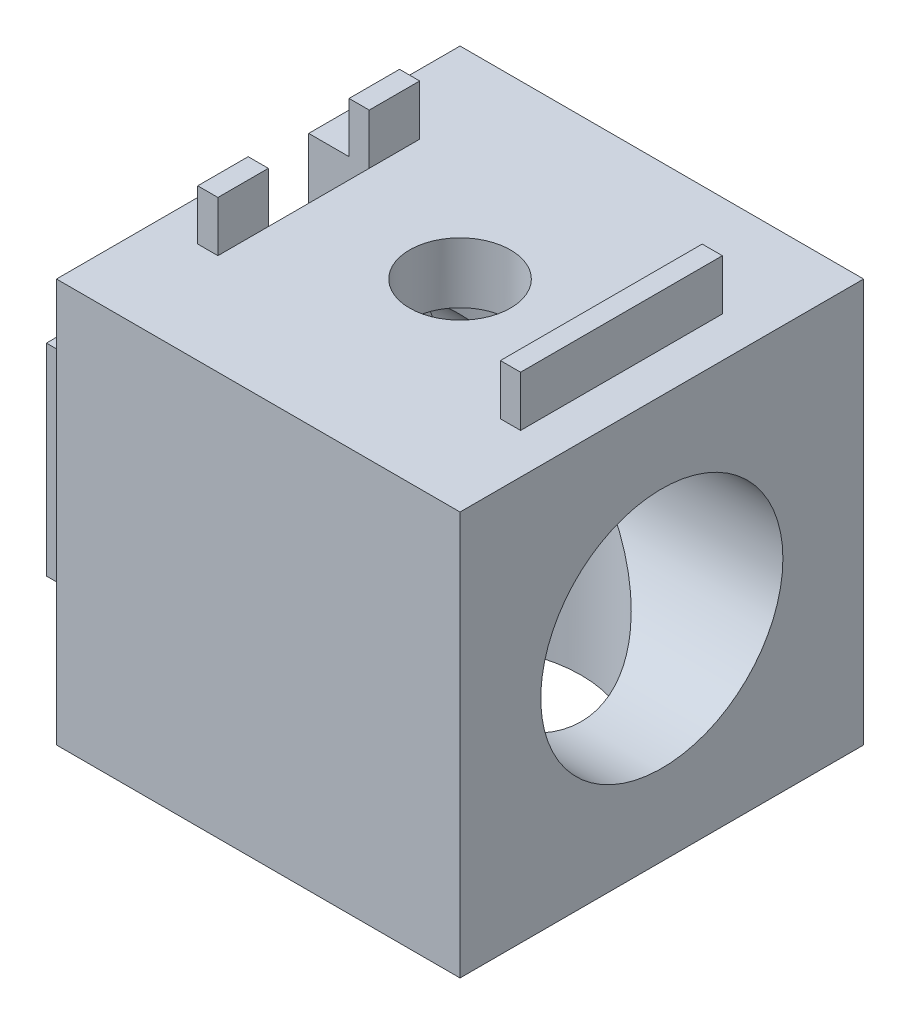
ISO-10303-21;
HEADER;
FILE_DESCRIPTION(('STEP AP214'),'2;1');
FILE_NAME('part.step','',(''),(''),'','','');
FILE_SCHEMA(('AUTOMOTIVE_DESIGN { 1 0 10303 214 1 1 1 1 }'));
ENDSEC;
DATA;
#1=APPLICATION_CONTEXT('core data for automotive mechanical design processes');
#2=APPLICATION_PROTOCOL_DEFINITION('international standard','automotive_design',2000,#1);
#3=PRODUCT_CONTEXT('',#1,'mechanical');
#4=PRODUCT('Part','Part','',(#3));
#5=PRODUCT_RELATED_PRODUCT_CATEGORY('part','',(#4));
#6=PRODUCT_DEFINITION_FORMATION('','',#4);
#7=PRODUCT_DEFINITION_CONTEXT('part definition',#1,'design');
#8=PRODUCT_DEFINITION('design','',#6,#7);
#9=PRODUCT_DEFINITION_SHAPE('','',#8);
#10=(LENGTH_UNIT() NAMED_UNIT(*) SI_UNIT(.MILLI.,.METRE.));
#11=(NAMED_UNIT(*) PLANE_ANGLE_UNIT() SI_UNIT($,.RADIAN.));
#12=(NAMED_UNIT(*) SI_UNIT($,.STERADIAN.) SOLID_ANGLE_UNIT());
#13=UNCERTAINTY_MEASURE_WITH_UNIT(LENGTH_MEASURE(1.E-05),#10,'distance_accuracy_value','');
#14=(GEOMETRIC_REPRESENTATION_CONTEXT(3) GLOBAL_UNCERTAINTY_ASSIGNED_CONTEXT((#13)) GLOBAL_UNIT_ASSIGNED_CONTEXT((#10,
#11,#12)) REPRESENTATION_CONTEXT('',''));
#15=CARTESIAN_POINT('',(0.,0.,0.));
#16=DIRECTION('',(0.,0.,1.));
#17=DIRECTION('',(1.,0.,0.));
#18=AXIS2_PLACEMENT_3D('',#15,#16,#17);
#19=CARTESIAN_POINT('',(10.,0.,-10.));
#20=DIRECTION('',(0.,1.,0.));
#21=DIRECTION('',(0.,0.,1.));
#22=AXIS2_PLACEMENT_3D('',#19,#20,#21);
#23=CYLINDRICAL_SURFACE('',#22,2.5);
#24=CARTESIAN_POINT('',(10.,20.,-10.));
#25=DIRECTION('',(0.,1.,0.));
#26=DIRECTION('',(0.,0.,1.));
#27=AXIS2_PLACEMENT_3D('',#24,#25,#26);
#28=CIRCLE('',#27,2.5);
#29=CARTESIAN_POINT('',(10.,20.,-7.5));
#30=VERTEX_POINT('',#29);
#31=EDGE_CURVE('E481',#30,#30,#28,.T.);
#32=ORIENTED_EDGE('',*,*,#31,.T.);
#33=EDGE_LOOP('',(#32));
#34=FACE_BOUND('',#33,.T.);
#35=CARTESIAN_POINT('',(10.,17.,-10.));
#36=DIRECTION('',(0.,-1.,0.));
#37=DIRECTION('',(0.,0.,-1.));
#38=AXIS2_PLACEMENT_3D('',#35,#36,#37);
#39=CIRCLE('',#38,2.5);
#40=CARTESIAN_POINT('',(10.,17.,-12.5));
#41=VERTEX_POINT('',#40);
#42=EDGE_CURVE('E37',#41,#41,#39,.F.);
#43=ORIENTED_EDGE('',*,*,#42,.F.);
#44=EDGE_LOOP('',(#43));
#45=FACE_BOUND('',#44,.T.);
#46=ADVANCED_FACE('F33',(#34,#45),#23,.F.);
#47=CARTESIAN_POINT('',(3.,10.,-10.));
#48=DIRECTION('',(1.,0.,0.));
#49=DIRECTION('',(0.,0.,-1.));
#50=AXIS2_PLACEMENT_3D('',#47,#48,#49);
#51=CYLINDRICAL_SURFACE('',#50,6.);
#52=CARTESIAN_POINT('',(20.,10.,-10.));
#53=DIRECTION('',(1.,0.,0.));
#54=DIRECTION('',(0.,0.,-1.));
#55=AXIS2_PLACEMENT_3D('',#52,#53,#54);
#56=CIRCLE('',#55,6.);
#57=CARTESIAN_POINT('',(20.,10.,-16.));
#58=VERTEX_POINT('',#57);
#59=EDGE_CURVE('E802',#58,#58,#56,.T.);
#60=ORIENTED_EDGE('',*,*,#59,.T.);
#61=EDGE_LOOP('',(#60));
#62=FACE_BOUND('',#61,.T.);
#63=CARTESIAN_POINT('',(10.,10.,-10.));
#64=DIRECTION('',(0.707106781186547,0.707106781186547,0.));
#65=DIRECTION('',(0.707106781186547,-0.707106781186547,0.));
#66=AXIS2_PLACEMENT_3D('',#63,#64,#65);
#67=ELLIPSE('',#66,8.48528137423857,6.);
#68=CARTESIAN_POINT('',(10.,10.,-16.));
#69=VERTEX_POINT('',#68);
#70=CARTESIAN_POINT('',(10.,10.,-4.));
#71=VERTEX_POINT('',#70);
#72=EDGE_CURVE('E47',#69,#71,#67,.F.);
#73=ORIENTED_EDGE('',*,*,#72,.T.);
#74=CARTESIAN_POINT('',(10.,10.,-10.));
#75=DIRECTION('',(0.707106781186547,-0.707106781186547,0.));
#76=DIRECTION('',(0.707106781186547,0.707106781186547,0.));
#77=AXIS2_PLACEMENT_3D('',#74,#75,#76);
#78=ELLIPSE('',#77,8.48528137423857,6.);
#79=EDGE_CURVE('E11',#71,#69,#78,.F.);
#80=ORIENTED_EDGE('',*,*,#79,.T.);
#81=EDGE_LOOP('',(#73,#80));
#82=FACE_BOUND('',#81,.T.);
#83=ADVANCED_FACE('F240',(#62,#82),#51,.F.);
#84=CARTESIAN_POINT('',(3.,20.,-7.5));
#85=DIRECTION('',(1.,0.,0.));
#86=DIRECTION('',(0.,0.,-1.));
#87=AXIS2_PLACEMENT_3D('',#84,#85,#86);
#88=PLANE('',#87);
#89=DIRECTION('',(0.,-1.,0.));
#90=VECTOR('',#89,1.);
#91=CARTESIAN_POINT('',(3.,20.,-12.5));
#92=LINE('',#91,#90);
#93=CARTESIAN_POINT('',(3.,20.,-12.5));
#94=VERTEX_POINT('',#93);
#95=CARTESIAN_POINT('',(3.,15.4543560573179,-12.5));
#96=VERTEX_POINT('',#95);
#97=EDGE_CURVE('E297',#94,#96,#92,.T.);
#98=ORIENTED_EDGE('',*,*,#97,.T.);
#99=CARTESIAN_POINT('',(3.,10.,-10.));
#100=DIRECTION('',(1.,0.,0.));
#101=DIRECTION('',(0.,0.,-1.));
#102=AXIS2_PLACEMENT_3D('',#99,#100,#101);
#103=CIRCLE('',#102,6.);
#104=CARTESIAN_POINT('',(3.,15.4543560573179,-7.5));
#105=VERTEX_POINT('',#104);
#106=EDGE_CURVE('E363',#96,#105,#103,.T.);
#107=ORIENTED_EDGE('',*,*,#106,.T.);
#108=DIRECTION('',(0.,-1.,0.));
#109=VECTOR('',#108,1.);
#110=CARTESIAN_POINT('',(3.,20.,-7.5));
#111=LINE('',#110,#109);
#112=CARTESIAN_POINT('',(3.,20.,-7.5));
#113=VERTEX_POINT('',#112);
#114=EDGE_CURVE('E292',#113,#105,#111,.T.);
#115=ORIENTED_EDGE('',*,*,#114,.F.);
#116=DIRECTION('',(0.,0.,1.));
#117=VECTOR('',#116,1.);
#118=CARTESIAN_POINT('',(3.,20.,-7.5));
#119=LINE('',#118,#117);
#120=EDGE_CURVE('E263',#94,#113,#119,.T.);
#121=ORIENTED_EDGE('',*,*,#120,.F.);
#122=EDGE_LOOP('',(#98,#107,#115,#121));
#123=FACE_BOUND('',#122,.T.);
#124=ADVANCED_FACE('F361',(#123),#88,.F.);
#125=CARTESIAN_POINT('',(0.,20.,-12.5));
#126=DIRECTION('',(1.,0.,0.));
#127=DIRECTION('',(0.,0.,-1.));
#128=AXIS2_PLACEMENT_3D('',#125,#126,#127);
#129=PLANE('',#128);
#130=DIRECTION('',(0.,0.,1.));
#131=VECTOR('',#130,1.);
#132=CARTESIAN_POINT('',(0.,0.,-12.5));
#133=LINE('',#132,#131);
#134=CARTESIAN_POINT('',(0.,0.,-20.));
#135=VERTEX_POINT('',#134);
#136=CARTESIAN_POINT('',(0.,0.,-12.5));
#137=VERTEX_POINT('',#136);
#138=EDGE_CURVE('E278',#135,#137,#133,.T.);
#139=ORIENTED_EDGE('',*,*,#138,.T.);
#140=DIRECTION('',(0.,-1.,0.));
#141=VECTOR('',#140,1.);
#142=CARTESIAN_POINT('',(0.,20.,-12.5));
#143=LINE('',#142,#141);
#144=CARTESIAN_POINT('',(0.,20.,-12.5));
#145=VERTEX_POINT('',#144);
#146=EDGE_CURVE('E300',#145,#137,#143,.T.);
#147=ORIENTED_EDGE('',*,*,#146,.F.);
#148=DIRECTION('',(0.,0.,1.));
#149=VECTOR('',#148,1.);
#150=CARTESIAN_POINT('',(0.,20.,-12.5));
#151=LINE('',#150,#149);
#152=CARTESIAN_POINT('',(0.,20.,-20.));
#153=VERTEX_POINT('',#152);
#154=EDGE_CURVE('E340',#153,#145,#151,.T.);
#155=ORIENTED_EDGE('',*,*,#154,.F.);
#156=DIRECTION('',(0.,-1.,0.));
#157=VECTOR('',#156,1.);
#158=CARTESIAN_POINT('',(0.,20.,-20.));
#159=LINE('',#158,#157);
#160=EDGE_CURVE('E303',#153,#135,#159,.T.);
#161=ORIENTED_EDGE('',*,*,#160,.T.);
#162=EDGE_LOOP('',(#139,#147,#155,#161));
#163=FACE_BOUND('',#162,.T.);
#164=DIRECTION('',(0.,-1.,0.));
#165=VECTOR('',#164,1.);
#166=CARTESIAN_POINT('',(0.,15.,-18.));
#167=LINE('',#166,#165);
#168=CARTESIAN_POINT('',(0.,15.,-18.));
#169=VERTEX_POINT('',#168);
#170=CARTESIAN_POINT('',(0.,5.,-18.));
#171=VERTEX_POINT('',#170);
#172=EDGE_CURVE('E410',#169,#171,#167,.T.);
#173=ORIENTED_EDGE('',*,*,#172,.F.);
#174=DIRECTION('',(0.,0.,-1.));
#175=VECTOR('',#174,1.);
#176=CARTESIAN_POINT('',(0.,15.,-18.));
#177=LINE('',#176,#175);
#178=CARTESIAN_POINT('',(0.,15.,-17.));
#179=VERTEX_POINT('',#178);
#180=EDGE_CURVE('E412',#179,#169,#177,.T.);
#181=ORIENTED_EDGE('',*,*,#180,.F.);
#182=DIRECTION('',(0.,1.,0.));
#183=VECTOR('',#182,1.);
#184=CARTESIAN_POINT('',(0.,15.,-17.));
#185=LINE('',#184,#183);
#186=CARTESIAN_POINT('',(0.,5.,-17.));
#187=VERTEX_POINT('',#186);
#188=EDGE_CURVE('E432',#187,#179,#185,.T.);
#189=ORIENTED_EDGE('',*,*,#188,.F.);
#190=DIRECTION('',(0.,0.,1.));
#191=VECTOR('',#190,1.);
#192=CARTESIAN_POINT('',(0.,5.,-18.));
#193=LINE('',#192,#191);
#194=EDGE_CURVE('E415',#171,#187,#193,.T.);
#195=ORIENTED_EDGE('',*,*,#194,.F.);
#196=EDGE_LOOP('',(#173,#181,#189,#195));
#197=FACE_BOUND('',#196,.T.);
#198=ADVANCED_FACE('F405',(#163,#197),#129,.F.);
#199=CARTESIAN_POINT('',(0.,20.,0.));
#200=DIRECTION('',(1.,0.,0.));
#201=DIRECTION('',(0.,0.,-1.));
#202=AXIS2_PLACEMENT_3D('',#199,#200,#201);
#203=PLANE('',#202);
#204=DIRECTION('',(0.,0.,1.));
#205=VECTOR('',#204,1.);
#206=CARTESIAN_POINT('',(0.,0.,0.));
#207=LINE('',#206,#205);
#208=CARTESIAN_POINT('',(0.,0.,-7.5));
#209=VERTEX_POINT('',#208);
#210=CARTESIAN_POINT('',(0.,0.,0.));
#211=VERTEX_POINT('',#210);
#212=EDGE_CURVE('E269',#209,#211,#207,.T.);
#213=ORIENTED_EDGE('',*,*,#212,.T.);
#214=DIRECTION('',(0.,-1.,0.));
#215=VECTOR('',#214,1.);
#216=CARTESIAN_POINT('',(0.,20.,0.));
#217=LINE('',#216,#215);
#218=CARTESIAN_POINT('',(0.,20.,0.));
#219=VERTEX_POINT('',#218);
#220=EDGE_CURVE('E238',#219,#211,#217,.T.);
#221=ORIENTED_EDGE('',*,*,#220,.F.);
#222=DIRECTION('',(0.,0.,1.));
#223=VECTOR('',#222,1.);
#224=CARTESIAN_POINT('',(0.,20.,0.));
#225=LINE('',#224,#223);
#226=CARTESIAN_POINT('',(0.,20.,-7.5));
#227=VERTEX_POINT('',#226);
#228=EDGE_CURVE('E288',#227,#219,#225,.T.);
#229=ORIENTED_EDGE('',*,*,#228,.F.);
#230=DIRECTION('',(0.,-1.,0.));
#231=VECTOR('',#230,1.);
#232=CARTESIAN_POINT('',(0.,20.,-7.5));
#233=LINE('',#232,#231);
#234=EDGE_CURVE('E262',#227,#209,#233,.T.);
#235=ORIENTED_EDGE('',*,*,#234,.T.);
#236=EDGE_LOOP('',(#213,#221,#229,#235));
#237=FACE_BOUND('',#236,.T.);
#238=DIRECTION('',(0.,1.,0.));
#239=VECTOR('',#238,1.);
#240=CARTESIAN_POINT('',(0.,15.,-2.));
#241=LINE('',#240,#239);
#242=CARTESIAN_POINT('',(0.,5.,-2.));
#243=VERTEX_POINT('',#242);
#244=CARTESIAN_POINT('',(0.,15.,-2.));
#245=VERTEX_POINT('',#244);
#246=EDGE_CURVE('E448',#243,#245,#241,.T.);
#247=ORIENTED_EDGE('',*,*,#246,.F.);
#248=DIRECTION('',(0.,0.,1.));
#249=VECTOR('',#248,1.);
#250=CARTESIAN_POINT('',(0.,5.,-2.));
#251=LINE('',#250,#249);
#252=CARTESIAN_POINT('',(0.,5.,-3.));
#253=VERTEX_POINT('',#252);
#254=EDGE_CURVE('E453',#253,#243,#251,.T.);
#255=ORIENTED_EDGE('',*,*,#254,.F.);
#256=DIRECTION('',(0.,-1.,0.));
#257=VECTOR('',#256,1.);
#258=CARTESIAN_POINT('',(0.,15.,-3.));
#259=LINE('',#258,#257);
#260=CARTESIAN_POINT('',(0.,15.,-3.));
#261=VERTEX_POINT('',#260);
#262=EDGE_CURVE('E465',#261,#253,#259,.T.);
#263=ORIENTED_EDGE('',*,*,#262,.F.);
#264=DIRECTION('',(0.,0.,-1.));
#265=VECTOR('',#264,1.);
#266=CARTESIAN_POINT('',(0.,15.,-2.));
#267=LINE('',#266,#265);
#268=EDGE_CURVE('E462',#245,#261,#267,.T.);
#269=ORIENTED_EDGE('',*,*,#268,.F.);
#270=EDGE_LOOP('',(#247,#255,#263,#269));
#271=FACE_BOUND('',#270,.T.);
#272=ADVANCED_FACE('F35',(#237,#271),#203,.F.);
#273=CARTESIAN_POINT('',(0.,20.,0.));
#274=DIRECTION('',(0.,0.,-1.));
#275=DIRECTION('',(-1.,0.,0.));
#276=AXIS2_PLACEMENT_3D('',#273,#274,#275);
#277=PLANE('',#276);
#278=DIRECTION('',(1.,0.,0.));
#279=VECTOR('',#278,1.);
#280=CARTESIAN_POINT('',(0.,0.,0.));
#281=LINE('',#280,#279);
#282=CARTESIAN_POINT('',(20.,0.,0.));
#283=VERTEX_POINT('',#282);
#284=EDGE_CURVE('E272',#211,#283,#281,.T.);
#285=ORIENTED_EDGE('',*,*,#284,.T.);
#286=DIRECTION('',(0.,-1.,0.));
#287=VECTOR('',#286,1.);
#288=CARTESIAN_POINT('',(20.,20.,0.));
#289=LINE('',#288,#287);
#290=CARTESIAN_POINT('',(20.,20.,0.));
#291=VERTEX_POINT('',#290);
#292=EDGE_CURVE('E308',#291,#283,#289,.T.);
#293=ORIENTED_EDGE('',*,*,#292,.F.);
#294=DIRECTION('',(1.,0.,0.));
#295=VECTOR('',#294,1.);
#296=CARTESIAN_POINT('',(0.,20.,0.));
#297=LINE('',#296,#295);
#298=EDGE_CURVE('E318',#219,#291,#297,.T.);
#299=ORIENTED_EDGE('',*,*,#298,.F.);
#300=ORIENTED_EDGE('',*,*,#220,.T.);
#301=EDGE_LOOP('',(#285,#293,#299,#300));
#302=FACE_BOUND('',#301,.T.);
#303=ADVANCED_FACE('F317',(#302),#277,.F.);
#304=CARTESIAN_POINT('',(20.,20.,0.));
#305=DIRECTION('',(-1.,0.,0.));
#306=DIRECTION('',(0.,0.,1.));
#307=AXIS2_PLACEMENT_3D('',#304,#305,#306);
#308=PLANE('',#307);
#309=ORIENTED_EDGE('',*,*,#59,.F.);
#310=EDGE_LOOP('',(#309));
#311=FACE_BOUND('',#310,.T.);
#312=DIRECTION('',(0.,0.,-1.));
#313=VECTOR('',#312,1.);
#314=CARTESIAN_POINT('',(20.,0.,0.));
#315=LINE('',#314,#313);
#316=CARTESIAN_POINT('',(20.,0.,-20.));
#317=VERTEX_POINT('',#316);
#318=EDGE_CURVE('E274',#283,#317,#315,.T.);
#319=ORIENTED_EDGE('',*,*,#318,.T.);
#320=DIRECTION('',(0.,-1.,0.));
#321=VECTOR('',#320,1.);
#322=CARTESIAN_POINT('',(20.,20.,-20.));
#323=LINE('',#322,#321);
#324=CARTESIAN_POINT('',(20.,20.,-20.));
#325=VERTEX_POINT('',#324);
#326=EDGE_CURVE('E306',#325,#317,#323,.T.);
#327=ORIENTED_EDGE('',*,*,#326,.F.);
#328=DIRECTION('',(0.,0.,-1.));
#329=VECTOR('',#328,1.);
#330=CARTESIAN_POINT('',(20.,20.,0.));
#331=LINE('',#330,#329);
#332=EDGE_CURVE('E341',#291,#325,#331,.T.);
#333=ORIENTED_EDGE('',*,*,#332,.F.);
#334=ORIENTED_EDGE('',*,*,#292,.T.);
#335=EDGE_LOOP('',(#319,#327,#333,#334));
#336=FACE_BOUND('',#335,.T.);
#337=ADVANCED_FACE('F332',(#311,#336),#308,.F.);
#338=CARTESIAN_POINT('',(0.,20.,-20.));
#339=DIRECTION('',(0.,0.,1.));
#340=DIRECTION('',(1.,0.,0.));
#341=AXIS2_PLACEMENT_3D('',#338,#339,#340);
#342=PLANE('',#341);
#343=DIRECTION('',(-1.,0.,0.));
#344=VECTOR('',#343,1.);
#345=CARTESIAN_POINT('',(0.,0.,-20.));
#346=LINE('',#345,#344);
#347=EDGE_CURVE('E276',#317,#135,#346,.T.);
#348=ORIENTED_EDGE('',*,*,#347,.T.);
#349=ORIENTED_EDGE('',*,*,#160,.F.);
#350=DIRECTION('',(-1.,0.,0.));
#351=VECTOR('',#350,1.);
#352=CARTESIAN_POINT('',(0.,20.,-20.));
#353=LINE('',#352,#351);
#354=EDGE_CURVE('E337',#325,#153,#353,.T.);
#355=ORIENTED_EDGE('',*,*,#354,.F.);
#356=ORIENTED_EDGE('',*,*,#326,.T.);
#357=EDGE_LOOP('',(#348,#349,#355,#356));
#358=FACE_BOUND('',#357,.T.);
#359=ADVANCED_FACE('F335',(#358),#342,.F.);
#360=CARTESIAN_POINT('',(3.,20.,-12.5));
#361=DIRECTION('',(0.,0.,-1.));
#362=DIRECTION('',(-1.,0.,0.));
#363=AXIS2_PLACEMENT_3D('',#360,#361,#362);
#364=PLANE('',#363);
#365=DIRECTION('',(1.,0.,0.));
#366=VECTOR('',#365,1.);
#367=CARTESIAN_POINT('',(3.,0.,-12.5));
#368=LINE('',#367,#366);
#369=CARTESIAN_POINT('',(3.,0.,-12.5));
#370=VERTEX_POINT('',#369);
#371=EDGE_CURVE('E280',#137,#370,#368,.T.);
#372=ORIENTED_EDGE('',*,*,#371,.T.);
#373=CARTESIAN_POINT('',(3.,4.54564394268214,-12.5));
#374=VERTEX_POINT('',#373);
#375=EDGE_CURVE('E295',#374,#370,#92,.T.);
#376=ORIENTED_EDGE('',*,*,#375,.F.);
#377=DIRECTION('',(0.,-1.,0.));
#378=VECTOR('',#377,1.);
#379=CARTESIAN_POINT('',(3.,20.,-12.5));
#380=LINE('',#379,#378);
#381=EDGE_CURVE('E420',#96,#374,#380,.T.);
#382=ORIENTED_EDGE('',*,*,#381,.F.);
#383=ORIENTED_EDGE('',*,*,#97,.F.);
#384=DIRECTION('',(0.,-1.,0.));
#385=VECTOR('',#384,1.);
#386=CARTESIAN_POINT('',(3.,22.5,-12.5));
#387=LINE('',#386,#385);
#388=CARTESIAN_POINT('',(3.,22.5,-12.5));
#389=VERTEX_POINT('',#388);
#390=EDGE_CURVE('E527',#389,#94,#387,.T.);
#391=ORIENTED_EDGE('',*,*,#390,.F.);
#392=DIRECTION('',(1.,0.,0.));
#393=VECTOR('',#392,1.);
#394=CARTESIAN_POINT('',(0.,22.5,-12.5));
#395=LINE('',#394,#393);
#396=CARTESIAN_POINT('',(2.,22.5,-12.5));
#397=VERTEX_POINT('',#396);
#398=EDGE_CURVE('E525',#397,#389,#395,.T.);
#399=ORIENTED_EDGE('',*,*,#398,.F.);
#400=DIRECTION('',(0.,-1.,0.));
#401=VECTOR('',#400,1.);
#402=CARTESIAN_POINT('',(2.,22.5,-12.5));
#403=LINE('',#402,#401);
#404=CARTESIAN_POINT('',(2.,20.,-12.5));
#405=VERTEX_POINT('',#404);
#406=EDGE_CURVE('E533',#397,#405,#403,.T.);
#407=ORIENTED_EDGE('',*,*,#406,.T.);
#408=DIRECTION('',(1.,0.,0.));
#409=VECTOR('',#408,1.);
#410=CARTESIAN_POINT('',(3.,20.,-12.5));
#411=LINE('',#410,#409);
#412=EDGE_CURVE('E343',#145,#405,#411,.T.);
#413=ORIENTED_EDGE('',*,*,#412,.F.);
#414=ORIENTED_EDGE('',*,*,#146,.T.);
#415=EDGE_LOOP('',(#372,#376,#382,#383,#391,#399,#407,#413,#414));
#416=FACE_BOUND('',#415,.T.);
#417=ADVANCED_FACE('F400',(#416),#364,.F.);
#418=CARTESIAN_POINT('',(3.,4.54564394268214,-7.5));
#419=VERTEX_POINT('',#418);
#420=CARTESIAN_POINT('',(3.,0.,-7.5));
#421=VERTEX_POINT('',#420);
#422=EDGE_CURVE('E291',#419,#421,#111,.T.);
#423=ORIENTED_EDGE('',*,*,#422,.F.);
#424=EDGE_CURVE('E818',#419,#374,#103,.T.);
#425=ORIENTED_EDGE('',*,*,#424,.T.);
#426=ORIENTED_EDGE('',*,*,#375,.T.);
#427=DIRECTION('',(0.,0.,1.));
#428=VECTOR('',#427,1.);
#429=CARTESIAN_POINT('',(3.,0.,-7.5));
#430=LINE('',#429,#428);
#431=EDGE_CURVE('E283',#370,#421,#430,.T.);
#432=ORIENTED_EDGE('',*,*,#431,.T.);
#433=EDGE_LOOP('',(#423,#425,#426,#432));
#434=FACE_BOUND('',#433,.T.);
#435=ADVANCED_FACE('F396',(#434),#88,.F.);
#436=CARTESIAN_POINT('',(0.,20.,-7.5));
#437=DIRECTION('',(0.,0.,1.));
#438=DIRECTION('',(1.,0.,0.));
#439=AXIS2_PLACEMENT_3D('',#436,#437,#438);
#440=PLANE('',#439);
#441=DIRECTION('',(-1.,0.,0.));
#442=VECTOR('',#441,1.);
#443=CARTESIAN_POINT('',(0.,0.,-7.5));
#444=LINE('',#443,#442);
#445=EDGE_CURVE('E286',#421,#209,#444,.T.);
#446=ORIENTED_EDGE('',*,*,#445,.T.);
#447=ORIENTED_EDGE('',*,*,#234,.F.);
#448=DIRECTION('',(-1.,0.,0.));
#449=VECTOR('',#448,1.);
#450=CARTESIAN_POINT('',(0.,20.,-7.5));
#451=LINE('',#450,#449);
#452=CARTESIAN_POINT('',(2.,20.,-7.5));
#453=VERTEX_POINT('',#452);
#454=EDGE_CURVE('E259',#453,#227,#451,.T.);
#455=ORIENTED_EDGE('',*,*,#454,.F.);
#456=DIRECTION('',(0.,-1.,0.));
#457=VECTOR('',#456,1.);
#458=CARTESIAN_POINT('',(2.,22.5,-7.5));
#459=LINE('',#458,#457);
#460=CARTESIAN_POINT('',(2.,22.5,-7.5));
#461=VERTEX_POINT('',#460);
#462=EDGE_CURVE('E247',#461,#453,#459,.T.);
#463=ORIENTED_EDGE('',*,*,#462,.F.);
#464=DIRECTION('',(-1.,0.,0.));
#465=VECTOR('',#464,1.);
#466=CARTESIAN_POINT('',(0.,22.5,-7.5));
#467=LINE('',#466,#465);
#468=CARTESIAN_POINT('',(3.,22.5,-7.5));
#469=VERTEX_POINT('',#468);
#470=EDGE_CURVE('E369',#469,#461,#467,.T.);
#471=ORIENTED_EDGE('',*,*,#470,.F.);
#472=DIRECTION('',(0.,-1.,0.));
#473=VECTOR('',#472,1.);
#474=CARTESIAN_POINT('',(3.,22.5,-7.5));
#475=LINE('',#474,#473);
#476=EDGE_CURVE('E250',#469,#113,#475,.T.);
#477=ORIENTED_EDGE('',*,*,#476,.T.);
#478=ORIENTED_EDGE('',*,*,#114,.T.);
#479=EDGE_CURVE('E296',#105,#419,#111,.T.);
#480=ORIENTED_EDGE('',*,*,#479,.T.);
#481=ORIENTED_EDGE('',*,*,#422,.T.);
#482=EDGE_LOOP('',(#446,#447,#455,#463,#471,#477,#478,#480,#481));
#483=FACE_BOUND('',#482,.T.);
#484=ADVANCED_FACE('F367',(#483),#440,.F.);
#485=CARTESIAN_POINT('',(0.,20.,0.));
#486=DIRECTION('',(0.,-1.,0.));
#487=DIRECTION('',(0.,0.,-1.));
#488=AXIS2_PLACEMENT_3D('',#485,#486,#487);
#489=PLANE('',#488);
#490=ORIENTED_EDGE('',*,*,#31,.F.);
#491=EDGE_LOOP('',(#490));
#492=FACE_BOUND('',#491,.T.);
#493=DIRECTION('',(1.,0.,0.));
#494=VECTOR('',#493,1.);
#495=CARTESIAN_POINT('',(0.,20.,-15.));
#496=LINE('',#495,#494);
#497=CARTESIAN_POINT('',(17.,20.,-15.));
#498=VERTEX_POINT('',#497);
#499=CARTESIAN_POINT('',(18.,20.,-15.));
#500=VERTEX_POINT('',#499);
#501=EDGE_CURVE('E498',#498,#500,#496,.T.);
#502=ORIENTED_EDGE('',*,*,#501,.T.);
#503=DIRECTION('',(0.,0.,1.));
#504=VECTOR('',#503,1.);
#505=CARTESIAN_POINT('',(18.,20.,0.));
#506=LINE('',#505,#504);
#507=CARTESIAN_POINT('',(18.,20.,-5.));
#508=VERTEX_POINT('',#507);
#509=EDGE_CURVE('E484',#500,#508,#506,.T.);
#510=ORIENTED_EDGE('',*,*,#509,.T.);
#511=DIRECTION('',(1.,0.,0.));
#512=VECTOR('',#511,1.);
#513=CARTESIAN_POINT('',(0.,20.,-5.));
#514=LINE('',#513,#512);
#515=CARTESIAN_POINT('',(17.,20.,-5.));
#516=VERTEX_POINT('',#515);
#517=EDGE_CURVE('E489',#516,#508,#514,.T.);
#518=ORIENTED_EDGE('',*,*,#517,.F.);
#519=DIRECTION('',(0.,0.,1.));
#520=VECTOR('',#519,1.);
#521=CARTESIAN_POINT('',(17.,20.,0.));
#522=LINE('',#521,#520);
#523=EDGE_CURVE('E500',#498,#516,#522,.T.);
#524=ORIENTED_EDGE('',*,*,#523,.F.);
#525=EDGE_LOOP('',(#502,#510,#518,#524));
#526=FACE_BOUND('',#525,.T.);
#527=DIRECTION('',(1.,0.,0.));
#528=VECTOR('',#527,1.);
#529=CARTESIAN_POINT('',(0.,20.,-15.));
#530=LINE('',#529,#528);
#531=CARTESIAN_POINT('',(2.,20.,-15.));
#532=VERTEX_POINT('',#531);
#533=CARTESIAN_POINT('',(3.,20.,-15.));
#534=VERTEX_POINT('',#533);
#535=EDGE_CURVE('E529',#532,#534,#530,.T.);
#536=ORIENTED_EDGE('',*,*,#535,.T.);
#537=DIRECTION('',(0.,0.,1.));
#538=VECTOR('',#537,1.);
#539=CARTESIAN_POINT('',(3.,20.,0.));
#540=LINE('',#539,#538);
#541=EDGE_CURVE('E355',#534,#94,#540,.T.);
#542=ORIENTED_EDGE('',*,*,#541,.T.);
#543=ORIENTED_EDGE('',*,*,#120,.T.);
#544=DIRECTION('',(0.,0.,1.));
#545=VECTOR('',#544,1.);
#546=CARTESIAN_POINT('',(3.,20.,0.));
#547=LINE('',#546,#545);
#548=CARTESIAN_POINT('',(3.,20.,-5.));
#549=VERTEX_POINT('',#548);
#550=EDGE_CURVE('E258',#113,#549,#547,.T.);
#551=ORIENTED_EDGE('',*,*,#550,.T.);
#552=DIRECTION('',(1.,0.,0.));
#553=VECTOR('',#552,1.);
#554=CARTESIAN_POINT('',(0.,20.,-5.));
#555=LINE('',#554,#553);
#556=CARTESIAN_POINT('',(2.,20.,-5.));
#557=VERTEX_POINT('',#556);
#558=EDGE_CURVE('E257',#557,#549,#555,.T.);
#559=ORIENTED_EDGE('',*,*,#558,.F.);
#560=DIRECTION('',(0.,0.,1.));
#561=VECTOR('',#560,1.);
#562=CARTESIAN_POINT('',(2.,20.,0.));
#563=LINE('',#562,#561);
#564=EDGE_CURVE('E254',#453,#557,#563,.T.);
#565=ORIENTED_EDGE('',*,*,#564,.F.);
#566=ORIENTED_EDGE('',*,*,#454,.T.);
#567=ORIENTED_EDGE('',*,*,#228,.T.);
#568=ORIENTED_EDGE('',*,*,#298,.T.);
#569=ORIENTED_EDGE('',*,*,#332,.T.);
#570=ORIENTED_EDGE('',*,*,#354,.T.);
#571=ORIENTED_EDGE('',*,*,#154,.T.);
#572=ORIENTED_EDGE('',*,*,#412,.T.);
#573=DIRECTION('',(0.,0.,1.));
#574=VECTOR('',#573,1.);
#575=CARTESIAN_POINT('',(2.,20.,0.));
#576=LINE('',#575,#574);
#577=EDGE_CURVE('E520',#532,#405,#576,.T.);
#578=ORIENTED_EDGE('',*,*,#577,.F.);
#579=EDGE_LOOP('',(#536,#542,#543,#551,#559,#565,#566,#567,#568,#569,#570,#571,#572,#578));
#580=FACE_BOUND('',#579,.T.);
#581=ADVANCED_FACE('F351',(#492,#526,#580),#489,.F.);
#582=CARTESIAN_POINT('',(0.,0.,0.));
#583=DIRECTION('',(0.,-1.,0.));
#584=DIRECTION('',(0.,0.,-1.));
#585=AXIS2_PLACEMENT_3D('',#582,#583,#584);
#586=PLANE('',#585);
#587=CARTESIAN_POINT('',(10.,0.,-10.));
#588=DIRECTION('',(0.,-1.,0.));
#589=DIRECTION('',(0.,0.,-1.));
#590=AXIS2_PLACEMENT_3D('',#587,#588,#589);
#591=CIRCLE('',#590,6.);
#592=CARTESIAN_POINT('',(10.,0.,-16.));
#593=VERTEX_POINT('',#592);
#594=EDGE_CURVE('E799',#593,#593,#591,.T.);
#595=ORIENTED_EDGE('',*,*,#594,.F.);
#596=EDGE_LOOP('',(#595));
#597=FACE_BOUND('',#596,.T.);
#598=ORIENTED_EDGE('',*,*,#212,.F.);
#599=ORIENTED_EDGE('',*,*,#445,.F.);
#600=ORIENTED_EDGE('',*,*,#431,.F.);
#601=ORIENTED_EDGE('',*,*,#371,.F.);
#602=ORIENTED_EDGE('',*,*,#138,.F.);
#603=ORIENTED_EDGE('',*,*,#347,.F.);
#604=ORIENTED_EDGE('',*,*,#318,.F.);
#605=ORIENTED_EDGE('',*,*,#284,.F.);
#606=EDGE_LOOP('',(#598,#599,#600,#601,#602,#603,#604,#605));
#607=FACE_BOUND('',#606,.T.);
#608=ADVANCED_FACE('F327',(#597,#607),#586,.T.);
#609=CARTESIAN_POINT('',(3.,22.5,0.));
#610=DIRECTION('',(1.,0.,0.));
#611=DIRECTION('',(0.,0.,-1.));
#612=AXIS2_PLACEMENT_3D('',#609,#610,#611);
#613=PLANE('',#612);
#614=ORIENTED_EDGE('',*,*,#550,.F.);
#615=ORIENTED_EDGE('',*,*,#476,.F.);
#616=DIRECTION('',(0.,0.,1.));
#617=VECTOR('',#616,1.);
#618=CARTESIAN_POINT('',(3.,22.5,0.));
#619=LINE('',#618,#617);
#620=CARTESIAN_POINT('',(3.,22.5,-5.));
#621=VERTEX_POINT('',#620);
#622=EDGE_CURVE('E388',#469,#621,#619,.T.);
#623=ORIENTED_EDGE('',*,*,#622,.T.);
#624=DIRECTION('',(0.,-1.,0.));
#625=VECTOR('',#624,1.);
#626=CARTESIAN_POINT('',(3.,22.5,-5.));
#627=LINE('',#626,#625);
#628=EDGE_CURVE('E376',#621,#549,#627,.T.);
#629=ORIENTED_EDGE('',*,*,#628,.T.);
#630=EDGE_LOOP('',(#614,#615,#623,#629));
#631=FACE_BOUND('',#630,.T.);
#632=ADVANCED_FACE('F374',(#631),#613,.T.);
#633=CARTESIAN_POINT('',(2.,22.5,0.));
#634=DIRECTION('',(1.,0.,0.));
#635=DIRECTION('',(0.,0.,-1.));
#636=AXIS2_PLACEMENT_3D('',#633,#634,#635);
#637=PLANE('',#636);
#638=ORIENTED_EDGE('',*,*,#564,.T.);
#639=DIRECTION('',(0.,-1.,0.));
#640=VECTOR('',#639,1.);
#641=CARTESIAN_POINT('',(2.,22.5,-5.));
#642=LINE('',#641,#640);
#643=CARTESIAN_POINT('',(2.,22.5,-5.));
#644=VERTEX_POINT('',#643);
#645=EDGE_CURVE('E251',#644,#557,#642,.T.);
#646=ORIENTED_EDGE('',*,*,#645,.F.);
#647=DIRECTION('',(0.,0.,1.));
#648=VECTOR('',#647,1.);
#649=CARTESIAN_POINT('',(2.,22.5,0.));
#650=LINE('',#649,#648);
#651=EDGE_CURVE('E538',#461,#644,#650,.T.);
#652=ORIENTED_EDGE('',*,*,#651,.F.);
#653=ORIENTED_EDGE('',*,*,#462,.T.);
#654=EDGE_LOOP('',(#638,#646,#652,#653));
#655=FACE_BOUND('',#654,.T.);
#656=ADVANCED_FACE('F547',(#655),#637,.F.);
#657=CARTESIAN_POINT('',(0.,22.5,-5.));
#658=DIRECTION('',(0.,0.,-1.));
#659=DIRECTION('',(-1.,0.,0.));
#660=AXIS2_PLACEMENT_3D('',#657,#658,#659);
#661=PLANE('',#660);
#662=ORIENTED_EDGE('',*,*,#558,.T.);
#663=ORIENTED_EDGE('',*,*,#628,.F.);
#664=DIRECTION('',(1.,0.,0.));
#665=VECTOR('',#664,1.);
#666=CARTESIAN_POINT('',(0.,22.5,-5.));
#667=LINE('',#666,#665);
#668=EDGE_CURVE('E385',#644,#621,#667,.T.);
#669=ORIENTED_EDGE('',*,*,#668,.F.);
#670=ORIENTED_EDGE('',*,*,#645,.T.);
#671=EDGE_LOOP('',(#662,#663,#669,#670));
#672=FACE_BOUND('',#671,.T.);
#673=ADVANCED_FACE('F545',(#672),#661,.F.);
#674=CARTESIAN_POINT('',(0.,22.5,0.));
#675=DIRECTION('',(0.,1.,0.));
#676=DIRECTION('',(0.,0.,1.));
#677=AXIS2_PLACEMENT_3D('',#674,#675,#676);
#678=PLANE('',#677);
#679=ORIENTED_EDGE('',*,*,#622,.F.);
#680=ORIENTED_EDGE('',*,*,#470,.T.);
#681=ORIENTED_EDGE('',*,*,#651,.T.);
#682=ORIENTED_EDGE('',*,*,#668,.T.);
#683=EDGE_LOOP('',(#679,#680,#681,#682));
#684=FACE_BOUND('',#683,.T.);
#685=ADVANCED_FACE('F543',(#684),#678,.T.);
#686=CARTESIAN_POINT('',(3.,22.5,0.));
#687=DIRECTION('',(1.,0.,0.));
#688=DIRECTION('',(0.,0.,-1.));
#689=AXIS2_PLACEMENT_3D('',#686,#687,#688);
#690=PLANE('',#689);
#691=ORIENTED_EDGE('',*,*,#541,.F.);
#692=DIRECTION('',(0.,-1.,0.));
#693=VECTOR('',#692,1.);
#694=CARTESIAN_POINT('',(3.,22.5,-15.));
#695=LINE('',#694,#693);
#696=CARTESIAN_POINT('',(3.,22.5,-15.));
#697=VERTEX_POINT('',#696);
#698=EDGE_CURVE('E378',#697,#534,#695,.T.);
#699=ORIENTED_EDGE('',*,*,#698,.F.);
#700=DIRECTION('',(0.,0.,1.));
#701=VECTOR('',#700,1.);
#702=CARTESIAN_POINT('',(3.,22.5,0.));
#703=LINE('',#702,#701);
#704=EDGE_CURVE('E516',#697,#389,#703,.T.);
#705=ORIENTED_EDGE('',*,*,#704,.T.);
#706=ORIENTED_EDGE('',*,*,#390,.T.);
#707=EDGE_LOOP('',(#691,#699,#705,#706));
#708=FACE_BOUND('',#707,.T.);
#709=ADVANCED_FACE('F602',(#708),#690,.T.);
#710=CARTESIAN_POINT('',(0.,22.5,-15.));
#711=DIRECTION('',(0.,0.,-1.));
#712=DIRECTION('',(-1.,0.,0.));
#713=AXIS2_PLACEMENT_3D('',#710,#711,#712);
#714=PLANE('',#713);
#715=ORIENTED_EDGE('',*,*,#535,.F.);
#716=DIRECTION('',(0.,-1.,0.));
#717=VECTOR('',#716,1.);
#718=CARTESIAN_POINT('',(2.,22.5,-15.));
#719=LINE('',#718,#717);
#720=CARTESIAN_POINT('',(2.,22.5,-15.));
#721=VERTEX_POINT('',#720);
#722=EDGE_CURVE('E381',#721,#532,#719,.T.);
#723=ORIENTED_EDGE('',*,*,#722,.F.);
#724=DIRECTION('',(1.,0.,0.));
#725=VECTOR('',#724,1.);
#726=CARTESIAN_POINT('',(0.,22.5,-15.));
#727=LINE('',#726,#725);
#728=EDGE_CURVE('E519',#721,#697,#727,.T.);
#729=ORIENTED_EDGE('',*,*,#728,.T.);
#730=ORIENTED_EDGE('',*,*,#698,.T.);
#731=EDGE_LOOP('',(#715,#723,#729,#730));
#732=FACE_BOUND('',#731,.T.);
#733=ADVANCED_FACE('F598',(#732),#714,.T.);
#734=CARTESIAN_POINT('',(2.,22.5,0.));
#735=DIRECTION('',(1.,0.,0.));
#736=DIRECTION('',(0.,0.,-1.));
#737=AXIS2_PLACEMENT_3D('',#734,#735,#736);
#738=PLANE('',#737);
#739=ORIENTED_EDGE('',*,*,#577,.T.);
#740=ORIENTED_EDGE('',*,*,#406,.F.);
#741=DIRECTION('',(0.,0.,1.));
#742=VECTOR('',#741,1.);
#743=CARTESIAN_POINT('',(2.,22.5,0.));
#744=LINE('',#743,#742);
#745=EDGE_CURVE('E523',#721,#397,#744,.T.);
#746=ORIENTED_EDGE('',*,*,#745,.F.);
#747=ORIENTED_EDGE('',*,*,#722,.T.);
#748=EDGE_LOOP('',(#739,#740,#746,#747));
#749=FACE_BOUND('',#748,.T.);
#750=ADVANCED_FACE('F594',(#749),#738,.F.);
#751=CARTESIAN_POINT('',(0.,22.5,0.));
#752=DIRECTION('',(0.,1.,0.));
#753=DIRECTION('',(0.,0.,1.));
#754=AXIS2_PLACEMENT_3D('',#751,#752,#753);
#755=PLANE('',#754);
#756=ORIENTED_EDGE('',*,*,#704,.F.);
#757=ORIENTED_EDGE('',*,*,#728,.F.);
#758=ORIENTED_EDGE('',*,*,#745,.T.);
#759=ORIENTED_EDGE('',*,*,#398,.T.);
#760=EDGE_LOOP('',(#756,#757,#758,#759));
#761=FACE_BOUND('',#760,.T.);
#762=ADVANCED_FACE('F590',(#761),#755,.T.);
#763=CARTESIAN_POINT('',(18.,22.5,0.));
#764=DIRECTION('',(1.,0.,0.));
#765=DIRECTION('',(0.,0.,-1.));
#766=AXIS2_PLACEMENT_3D('',#763,#764,#765);
#767=PLANE('',#766);
#768=ORIENTED_EDGE('',*,*,#509,.F.);
#769=DIRECTION('',(0.,-1.,0.));
#770=VECTOR('',#769,1.);
#771=CARTESIAN_POINT('',(18.,22.5,-15.));
#772=LINE('',#771,#770);
#773=CARTESIAN_POINT('',(18.,22.5,-15.));
#774=VERTEX_POINT('',#773);
#775=EDGE_CURVE('E513',#774,#500,#772,.T.);
#776=ORIENTED_EDGE('',*,*,#775,.F.);
#777=DIRECTION('',(0.,0.,1.));
#778=VECTOR('',#777,1.);
#779=CARTESIAN_POINT('',(18.,22.5,0.));
#780=LINE('',#779,#778);
#781=CARTESIAN_POINT('',(18.,22.5,-5.));
#782=VERTEX_POINT('',#781);
#783=EDGE_CURVE('E485',#774,#782,#780,.T.);
#784=ORIENTED_EDGE('',*,*,#783,.T.);
#785=DIRECTION('',(0.,-1.,0.));
#786=VECTOR('',#785,1.);
#787=CARTESIAN_POINT('',(18.,22.5,-5.));
#788=LINE('',#787,#786);
#789=EDGE_CURVE('E496',#782,#508,#788,.T.);
#790=ORIENTED_EDGE('',*,*,#789,.T.);
#791=EDGE_LOOP('',(#768,#776,#784,#790));
#792=FACE_BOUND('',#791,.T.);
#793=ADVANCED_FACE('F586',(#792),#767,.T.);
#794=CARTESIAN_POINT('',(0.,22.5,-15.));
#795=DIRECTION('',(0.,0.,-1.));
#796=DIRECTION('',(-1.,0.,0.));
#797=AXIS2_PLACEMENT_3D('',#794,#795,#796);
#798=PLANE('',#797);
#799=ORIENTED_EDGE('',*,*,#501,.F.);
#800=DIRECTION('',(0.,-1.,0.));
#801=VECTOR('',#800,1.);
#802=CARTESIAN_POINT('',(17.,22.5,-15.));
#803=LINE('',#802,#801);
#804=CARTESIAN_POINT('',(17.,22.5,-15.));
#805=VERTEX_POINT('',#804);
#806=EDGE_CURVE('E510',#805,#498,#803,.T.);
#807=ORIENTED_EDGE('',*,*,#806,.F.);
#808=DIRECTION('',(1.,0.,0.));
#809=VECTOR('',#808,1.);
#810=CARTESIAN_POINT('',(0.,22.5,-15.));
#811=LINE('',#810,#809);
#812=EDGE_CURVE('E488',#805,#774,#811,.T.);
#813=ORIENTED_EDGE('',*,*,#812,.T.);
#814=ORIENTED_EDGE('',*,*,#775,.T.);
#815=EDGE_LOOP('',(#799,#807,#813,#814));
#816=FACE_BOUND('',#815,.T.);
#817=ADVANCED_FACE('F582',(#816),#798,.T.);
#818=CARTESIAN_POINT('',(17.,22.5,0.));
#819=DIRECTION('',(1.,0.,0.));
#820=DIRECTION('',(0.,0.,-1.));
#821=AXIS2_PLACEMENT_3D('',#818,#819,#820);
#822=PLANE('',#821);
#823=ORIENTED_EDGE('',*,*,#523,.T.);
#824=DIRECTION('',(0.,-1.,0.));
#825=VECTOR('',#824,1.);
#826=CARTESIAN_POINT('',(17.,22.5,-5.));
#827=LINE('',#826,#825);
#828=CARTESIAN_POINT('',(17.,22.5,-5.));
#829=VERTEX_POINT('',#828);
#830=EDGE_CURVE('E507',#829,#516,#827,.T.);
#831=ORIENTED_EDGE('',*,*,#830,.F.);
#832=DIRECTION('',(0.,0.,1.));
#833=VECTOR('',#832,1.);
#834=CARTESIAN_POINT('',(17.,22.5,0.));
#835=LINE('',#834,#833);
#836=EDGE_CURVE('E492',#805,#829,#835,.T.);
#837=ORIENTED_EDGE('',*,*,#836,.F.);
#838=ORIENTED_EDGE('',*,*,#806,.T.);
#839=EDGE_LOOP('',(#823,#831,#837,#838));
#840=FACE_BOUND('',#839,.T.);
#841=ADVANCED_FACE('F578',(#840),#822,.F.);
#842=CARTESIAN_POINT('',(0.,22.5,-5.));
#843=DIRECTION('',(0.,0.,-1.));
#844=DIRECTION('',(-1.,0.,0.));
#845=AXIS2_PLACEMENT_3D('',#842,#843,#844);
#846=PLANE('',#845);
#847=ORIENTED_EDGE('',*,*,#517,.T.);
#848=ORIENTED_EDGE('',*,*,#789,.F.);
#849=DIRECTION('',(1.,0.,0.));
#850=VECTOR('',#849,1.);
#851=CARTESIAN_POINT('',(0.,22.5,-5.));
#852=LINE('',#851,#850);
#853=EDGE_CURVE('E494',#829,#782,#852,.T.);
#854=ORIENTED_EDGE('',*,*,#853,.F.);
#855=ORIENTED_EDGE('',*,*,#830,.T.);
#856=EDGE_LOOP('',(#847,#848,#854,#855));
#857=FACE_BOUND('',#856,.T.);
#858=ADVANCED_FACE('F574',(#857),#846,.F.);
#859=CARTESIAN_POINT('',(0.,22.5,0.));
#860=DIRECTION('',(0.,1.,0.));
#861=DIRECTION('',(0.,0.,1.));
#862=AXIS2_PLACEMENT_3D('',#859,#860,#861);
#863=PLANE('',#862);
#864=ORIENTED_EDGE('',*,*,#783,.F.);
#865=ORIENTED_EDGE('',*,*,#812,.F.);
#866=ORIENTED_EDGE('',*,*,#836,.T.);
#867=ORIENTED_EDGE('',*,*,#853,.T.);
#868=EDGE_LOOP('',(#864,#865,#866,#867));
#869=FACE_BOUND('',#868,.T.);
#870=ADVANCED_FACE('F571',(#869),#863,.T.);
#871=CARTESIAN_POINT('',(-2.5,15.,-2.));
#872=DIRECTION('',(0.,0.,-1.));
#873=DIRECTION('',(0.,1.,0.));
#874=AXIS2_PLACEMENT_3D('',#871,#872,#873);
#875=PLANE('',#874);
#876=ORIENTED_EDGE('',*,*,#246,.T.);
#877=DIRECTION('',(1.,0.,0.));
#878=VECTOR('',#877,1.);
#879=CARTESIAN_POINT('',(-2.5,15.,-2.));
#880=LINE('',#879,#878);
#881=CARTESIAN_POINT('',(-2.5,15.,-2.));
#882=VERTEX_POINT('',#881);
#883=EDGE_CURVE('E478',#882,#245,#880,.T.);
#884=ORIENTED_EDGE('',*,*,#883,.F.);
#885=DIRECTION('',(0.,1.,0.));
#886=VECTOR('',#885,1.);
#887=CARTESIAN_POINT('',(-2.5,15.,-2.));
#888=LINE('',#887,#886);
#889=CARTESIAN_POINT('',(-2.5,5.,-2.));
#890=VERTEX_POINT('',#889);
#891=EDGE_CURVE('E449',#890,#882,#888,.T.);
#892=ORIENTED_EDGE('',*,*,#891,.F.);
#893=DIRECTION('',(1.,0.,0.));
#894=VECTOR('',#893,1.);
#895=CARTESIAN_POINT('',(-2.5,5.,-2.));
#896=LINE('',#895,#894);
#897=EDGE_CURVE('E459',#890,#243,#896,.T.);
#898=ORIENTED_EDGE('',*,*,#897,.T.);
#899=EDGE_LOOP('',(#876,#884,#892,#898));
#900=FACE_BOUND('',#899,.T.);
#901=ADVANCED_FACE('F569',(#900),#875,.F.);
#902=CARTESIAN_POINT('',(-2.5,15.,-2.));
#903=DIRECTION('',(0.,-1.,0.));
#904=DIRECTION('',(0.,0.,-1.));
#905=AXIS2_PLACEMENT_3D('',#902,#903,#904);
#906=PLANE('',#905);
#907=ORIENTED_EDGE('',*,*,#268,.T.);
#908=DIRECTION('',(1.,0.,0.));
#909=VECTOR('',#908,1.);
#910=CARTESIAN_POINT('',(-2.5,15.,-3.));
#911=LINE('',#910,#909);
#912=CARTESIAN_POINT('',(-2.5,15.,-3.));
#913=VERTEX_POINT('',#912);
#914=EDGE_CURVE('E475',#913,#261,#911,.T.);
#915=ORIENTED_EDGE('',*,*,#914,.F.);
#916=DIRECTION('',(0.,0.,-1.));
#917=VECTOR('',#916,1.);
#918=CARTESIAN_POINT('',(-2.5,15.,-2.));
#919=LINE('',#918,#917);
#920=EDGE_CURVE('E452',#882,#913,#919,.T.);
#921=ORIENTED_EDGE('',*,*,#920,.F.);
#922=ORIENTED_EDGE('',*,*,#883,.T.);
#923=EDGE_LOOP('',(#907,#915,#921,#922));
#924=FACE_BOUND('',#923,.T.);
#925=ADVANCED_FACE('F685',(#924),#906,.F.);
#926=CARTESIAN_POINT('',(-2.5,15.,-3.));
#927=DIRECTION('',(0.,0.,1.));
#928=DIRECTION('',(0.,-1.,0.));
#929=AXIS2_PLACEMENT_3D('',#926,#927,#928);
#930=PLANE('',#929);
#931=ORIENTED_EDGE('',*,*,#262,.T.);
#932=DIRECTION('',(1.,0.,0.));
#933=VECTOR('',#932,1.);
#934=CARTESIAN_POINT('',(-2.5,5.,-3.));
#935=LINE('',#934,#933);
#936=CARTESIAN_POINT('',(-2.5,5.,-3.));
#937=VERTEX_POINT('',#936);
#938=EDGE_CURVE('E472',#937,#253,#935,.T.);
#939=ORIENTED_EDGE('',*,*,#938,.F.);
#940=DIRECTION('',(0.,-1.,0.));
#941=VECTOR('',#940,1.);
#942=CARTESIAN_POINT('',(-2.5,15.,-3.));
#943=LINE('',#942,#941);
#944=EDGE_CURVE('E455',#913,#937,#943,.T.);
#945=ORIENTED_EDGE('',*,*,#944,.F.);
#946=ORIENTED_EDGE('',*,*,#914,.T.);
#947=EDGE_LOOP('',(#931,#939,#945,#946));
#948=FACE_BOUND('',#947,.T.);
#949=ADVANCED_FACE('F691',(#948),#930,.F.);
#950=CARTESIAN_POINT('',(-2.5,5.,-2.));
#951=DIRECTION('',(0.,1.,0.));
#952=DIRECTION('',(0.,0.,1.));
#953=AXIS2_PLACEMENT_3D('',#950,#951,#952);
#954=PLANE('',#953);
#955=ORIENTED_EDGE('',*,*,#254,.T.);
#956=ORIENTED_EDGE('',*,*,#897,.F.);
#957=DIRECTION('',(0.,0.,1.));
#958=VECTOR('',#957,1.);
#959=CARTESIAN_POINT('',(-2.5,5.,-2.));
#960=LINE('',#959,#958);
#961=EDGE_CURVE('E457',#937,#890,#960,.T.);
#962=ORIENTED_EDGE('',*,*,#961,.F.);
#963=ORIENTED_EDGE('',*,*,#938,.T.);
#964=EDGE_LOOP('',(#955,#956,#962,#963));
#965=FACE_BOUND('',#964,.T.);
#966=ADVANCED_FACE('F698',(#965),#954,.F.);
#967=CARTESIAN_POINT('',(-2.5,0.,0.));
#968=DIRECTION('',(1.,0.,0.));
#969=DIRECTION('',(0.,0.,-1.));
#970=AXIS2_PLACEMENT_3D('',#967,#968,#969);
#971=PLANE('',#970);
#972=ORIENTED_EDGE('',*,*,#891,.T.);
#973=ORIENTED_EDGE('',*,*,#920,.T.);
#974=ORIENTED_EDGE('',*,*,#944,.T.);
#975=ORIENTED_EDGE('',*,*,#961,.T.);
#976=EDGE_LOOP('',(#972,#973,#974,#975));
#977=FACE_BOUND('',#976,.T.);
#978=ADVANCED_FACE('F706',(#977),#971,.F.);
#979=CARTESIAN_POINT('',(-2.5,15.,-18.));
#980=DIRECTION('',(0.,0.,1.));
#981=DIRECTION('',(0.,-1.,0.));
#982=AXIS2_PLACEMENT_3D('',#979,#980,#981);
#983=PLANE('',#982);
#984=ORIENTED_EDGE('',*,*,#172,.T.);
#985=DIRECTION('',(1.,0.,0.));
#986=VECTOR('',#985,1.);
#987=CARTESIAN_POINT('',(-2.5,5.,-18.));
#988=LINE('',#987,#986);
#989=CARTESIAN_POINT('',(-2.5,5.,-18.));
#990=VERTEX_POINT('',#989);
#991=EDGE_CURVE('E446',#990,#171,#988,.T.);
#992=ORIENTED_EDGE('',*,*,#991,.F.);
#993=DIRECTION('',(0.,-1.,0.));
#994=VECTOR('',#993,1.);
#995=CARTESIAN_POINT('',(-2.5,15.,-18.));
#996=LINE('',#995,#994);
#997=CARTESIAN_POINT('',(-2.5,15.,-18.));
#998=VERTEX_POINT('',#997);
#999=EDGE_CURVE('E431',#998,#990,#996,.T.);
#1000=ORIENTED_EDGE('',*,*,#999,.F.);
#1001=DIRECTION('',(1.,0.,0.));
#1002=VECTOR('',#1001,1.);
#1003=CARTESIAN_POINT('',(-2.5,15.,-18.));
#1004=LINE('',#1003,#1002);
#1005=EDGE_CURVE('E427',#998,#169,#1004,.T.);
#1006=ORIENTED_EDGE('',*,*,#1005,.T.);
#1007=EDGE_LOOP('',(#984,#992,#1000,#1006));
#1008=FACE_BOUND('',#1007,.T.);
#1009=ADVANCED_FACE('F434',(#1008),#983,.F.);
#1010=CARTESIAN_POINT('',(-2.5,5.,-18.));
#1011=DIRECTION('',(0.,1.,0.));
#1012=DIRECTION('',(0.,0.,1.));
#1013=AXIS2_PLACEMENT_3D('',#1010,#1011,#1012);
#1014=PLANE('',#1013);
#1015=ORIENTED_EDGE('',*,*,#194,.T.);
#1016=DIRECTION('',(1.,0.,0.));
#1017=VECTOR('',#1016,1.);
#1018=CARTESIAN_POINT('',(-2.5,5.,-17.));
#1019=LINE('',#1018,#1017);
#1020=CARTESIAN_POINT('',(-2.5,5.,-17.));
#1021=VERTEX_POINT('',#1020);
#1022=EDGE_CURVE('E438',#1021,#187,#1019,.T.);
#1023=ORIENTED_EDGE('',*,*,#1022,.F.);
#1024=DIRECTION('',(0.,0.,1.));
#1025=VECTOR('',#1024,1.);
#1026=CARTESIAN_POINT('',(-2.5,5.,-18.));
#1027=LINE('',#1026,#1025);
#1028=EDGE_CURVE('E812',#990,#1021,#1027,.T.);
#1029=ORIENTED_EDGE('',*,*,#1028,.F.);
#1030=ORIENTED_EDGE('',*,*,#991,.T.);
#1031=EDGE_LOOP('',(#1015,#1023,#1029,#1030));
#1032=FACE_BOUND('',#1031,.T.);
#1033=ADVANCED_FACE('F721',(#1032),#1014,.F.);
#1034=CARTESIAN_POINT('',(-2.5,15.,-17.));
#1035=DIRECTION('',(0.,0.,-1.));
#1036=DIRECTION('',(0.,1.,0.));
#1037=AXIS2_PLACEMENT_3D('',#1034,#1035,#1036);
#1038=PLANE('',#1037);
#1039=ORIENTED_EDGE('',*,*,#188,.T.);
#1040=DIRECTION('',(1.,0.,0.));
#1041=VECTOR('',#1040,1.);
#1042=CARTESIAN_POINT('',(-2.5,15.,-17.));
#1043=LINE('',#1042,#1041);
#1044=CARTESIAN_POINT('',(-2.5,15.,-17.));
#1045=VERTEX_POINT('',#1044);
#1046=EDGE_CURVE('E430',#1045,#179,#1043,.T.);
#1047=ORIENTED_EDGE('',*,*,#1046,.F.);
#1048=DIRECTION('',(0.,1.,0.));
#1049=VECTOR('',#1048,1.);
#1050=CARTESIAN_POINT('',(-2.5,15.,-17.));
#1051=LINE('',#1050,#1049);
#1052=EDGE_CURVE('E440',#1021,#1045,#1051,.T.);
#1053=ORIENTED_EDGE('',*,*,#1052,.F.);
#1054=ORIENTED_EDGE('',*,*,#1022,.T.);
#1055=EDGE_LOOP('',(#1039,#1047,#1053,#1054));
#1056=FACE_BOUND('',#1055,.T.);
#1057=ADVANCED_FACE('F728',(#1056),#1038,.F.);
#1058=CARTESIAN_POINT('',(-2.5,15.,-18.));
#1059=DIRECTION('',(0.,-1.,0.));
#1060=DIRECTION('',(0.,0.,-1.));
#1061=AXIS2_PLACEMENT_3D('',#1058,#1059,#1060);
#1062=PLANE('',#1061);
#1063=ORIENTED_EDGE('',*,*,#180,.T.);
#1064=ORIENTED_EDGE('',*,*,#1005,.F.);
#1065=DIRECTION('',(0.,0.,-1.));
#1066=VECTOR('',#1065,1.);
#1067=CARTESIAN_POINT('',(-2.5,15.,-18.));
#1068=LINE('',#1067,#1066);
#1069=EDGE_CURVE('E436',#1045,#998,#1068,.T.);
#1070=ORIENTED_EDGE('',*,*,#1069,.F.);
#1071=ORIENTED_EDGE('',*,*,#1046,.T.);
#1072=EDGE_LOOP('',(#1063,#1064,#1070,#1071));
#1073=FACE_BOUND('',#1072,.T.);
#1074=ADVANCED_FACE('F425',(#1073),#1062,.F.);
#1075=CARTESIAN_POINT('',(-2.5,0.,0.));
#1076=DIRECTION('',(-1.,0.,0.));
#1077=DIRECTION('',(0.,0.,1.));
#1078=AXIS2_PLACEMENT_3D('',#1075,#1076,#1077);
#1079=PLANE('',#1078);
#1080=ORIENTED_EDGE('',*,*,#999,.T.);
#1081=ORIENTED_EDGE('',*,*,#1028,.T.);
#1082=ORIENTED_EDGE('',*,*,#1052,.T.);
#1083=ORIENTED_EDGE('',*,*,#1069,.T.);
#1084=EDGE_LOOP('',(#1080,#1081,#1082,#1083));
#1085=FACE_BOUND('',#1084,.T.);
#1086=ADVANCED_FACE('F743',(#1085),#1079,.T.);
#1087=CARTESIAN_POINT('',(3.,10.,-10.));
#1088=DIRECTION('',(1.,0.,0.));
#1089=DIRECTION('',(0.,0.,-1.));
#1090=AXIS2_PLACEMENT_3D('',#1087,#1088,#1089);
#1091=PLANE('',#1090);
#1092=ORIENTED_EDGE('',*,*,#381,.T.);
#1093=EDGE_CURVE('E807',#374,#96,#103,.T.);
#1094=ORIENTED_EDGE('',*,*,#1093,.T.);
#1095=EDGE_LOOP('',(#1092,#1094));
#1096=FACE_BOUND('',#1095,.T.);
#1097=ADVANCED_FACE('F750',(#1096),#1091,.T.);
#1098=ORIENTED_EDGE('',*,*,#479,.F.);
#1099=EDGE_CURVE('E54',#105,#419,#103,.T.);
#1100=ORIENTED_EDGE('',*,*,#1099,.T.);
#1101=EDGE_LOOP('',(#1098,#1100));
#1102=FACE_BOUND('',#1101,.T.);
#1103=ADVANCED_FACE('F757',(#1102),#1091,.T.);
#1104=CARTESIAN_POINT('',(10.,10.,-10.));
#1105=DIRECTION('',(0.707106781186547,0.707106781186547,0.));
#1106=DIRECTION('',(0.707106781186547,-0.707106781186547,0.));
#1107=AXIS2_PLACEMENT_3D('',#1104,#1105,#1106);
#1108=ELLIPSE('',#1107,8.48528137423857,6.);
#1109=EDGE_CURVE('E231',#69,#71,#1108,.T.);
#1110=ORIENTED_EDGE('',*,*,#1109,.T.);
#1111=CARTESIAN_POINT('',(10.,10.,-10.));
#1112=DIRECTION('',(0.707106781186547,-0.707106781186547,0.));
#1113=DIRECTION('',(0.707106781186547,0.707106781186547,0.));
#1114=AXIS2_PLACEMENT_3D('',#1111,#1112,#1113);
#1115=ELLIPSE('',#1114,8.48528137423857,6.);
#1116=EDGE_CURVE('E42',#71,#69,#1115,.T.);
#1117=ORIENTED_EDGE('',*,*,#1116,.T.);
#1118=EDGE_LOOP('',(#1110,#1117));
#1119=FACE_BOUND('',#1118,.T.);
#1120=ORIENTED_EDGE('',*,*,#106,.F.);
#1121=ORIENTED_EDGE('',*,*,#1093,.F.);
#1122=ORIENTED_EDGE('',*,*,#424,.F.);
#1123=ORIENTED_EDGE('',*,*,#1099,.F.);
#1124=EDGE_LOOP('',(#1120,#1121,#1122,#1123));
#1125=FACE_BOUND('',#1124,.T.);
#1126=ADVANCED_FACE('F241',(#1119,#1125),#51,.F.);
#1127=CARTESIAN_POINT('',(10.,17.,-10.));
#1128=DIRECTION('',(0.,-1.,0.));
#1129=DIRECTION('',(0.,0.,-1.));
#1130=AXIS2_PLACEMENT_3D('',#1127,#1128,#1129);
#1131=CYLINDRICAL_SURFACE('',#1130,6.);
#1132=ORIENTED_EDGE('',*,*,#594,.T.);
#1133=EDGE_LOOP('',(#1132));
#1134=FACE_BOUND('',#1133,.T.);
#1135=ORIENTED_EDGE('',*,*,#72,.F.);
#1136=ORIENTED_EDGE('',*,*,#1116,.F.);
#1137=EDGE_LOOP('',(#1135,#1136));
#1138=FACE_BOUND('',#1137,.T.);
#1139=ADVANCED_FACE('F237',(#1134,#1138),#1131,.F.);
#1140=CARTESIAN_POINT('',(10.,17.,-10.));
#1141=DIRECTION('',(0.,-1.,0.));
#1142=DIRECTION('',(0.,0.,-1.));
#1143=AXIS2_PLACEMENT_3D('',#1140,#1141,#1142);
#1144=PLANE('',#1143);
#1145=CARTESIAN_POINT('',(10.,17.,-10.));
#1146=DIRECTION('',(0.,-1.,0.));
#1147=DIRECTION('',(0.,0.,-1.));
#1148=AXIS2_PLACEMENT_3D('',#1145,#1146,#1147);
#1149=CIRCLE('',#1148,6.);
#1150=CARTESIAN_POINT('',(10.,17.,-16.));
#1151=VERTEX_POINT('',#1150);
#1152=EDGE_CURVE('E798',#1151,#1151,#1149,.T.);
#1153=ORIENTED_EDGE('',*,*,#1152,.T.);
#1154=EDGE_LOOP('',(#1153));
#1155=FACE_BOUND('',#1154,.T.);
#1156=ORIENTED_EDGE('',*,*,#42,.T.);
#1157=EDGE_LOOP('',(#1156));
#1158=FACE_BOUND('',#1157,.T.);
#1159=ADVANCED_FACE('F774',(#1155,#1158),#1144,.T.);
#1160=ORIENTED_EDGE('',*,*,#1152,.F.);
#1161=EDGE_LOOP('',(#1160));
#1162=FACE_BOUND('',#1161,.T.);
#1163=ORIENTED_EDGE('',*,*,#1109,.F.);
#1164=ORIENTED_EDGE('',*,*,#79,.F.);
#1165=EDGE_LOOP('',(#1163,#1164));
#1166=FACE_BOUND('',#1165,.T.);
#1167=ADVANCED_FACE('F232',(#1162,#1166),#1131,.F.);
#1168=CLOSED_SHELL('',(#46,#83,#124,#198,#272,#303,#337,#359,#417,#435,#484,#581,#608,#632,#656,
#673,#685,#709,#733,#750,#762,#793,#817,#841,#858,#870,#901,#925,#949,#966,#978,#1009,#1033,
#1057,#1074,#1086,#1097,#1103,#1126,#1139,#1159,#1167));
#1169=MANIFOLD_SOLID_BREP('B2',#1168);
#1170=ADVANCED_BREP_SHAPE_REPRESENTATION('',(#18,#1169),#14);
#1171=SHAPE_DEFINITION_REPRESENTATION(#9,#1170);
ENDSEC;
END-ISO-10303-21;
